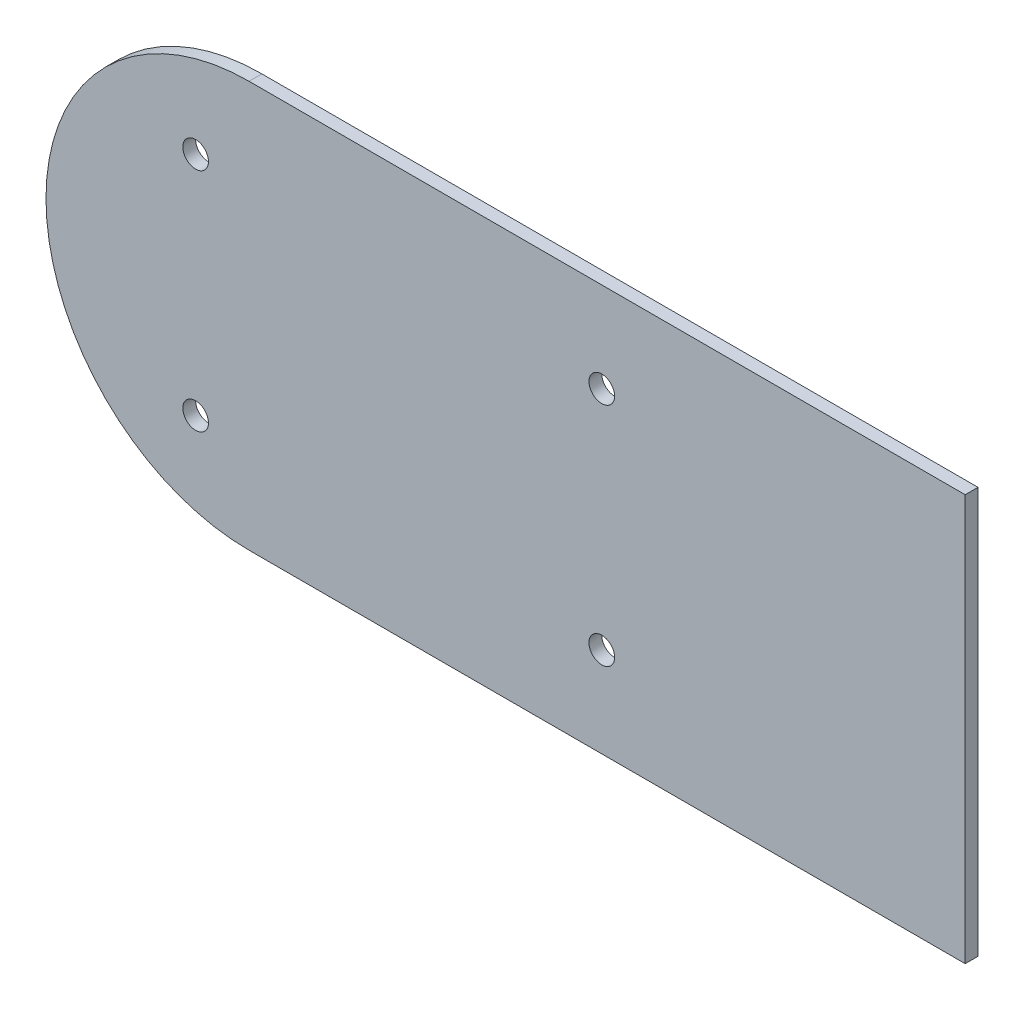
ISO-10303-21;
HEADER;
FILE_DESCRIPTION(('STEP AP214'),'2;1');
FILE_NAME('part.step','',(''),(''),'','','');
FILE_SCHEMA(('AUTOMOTIVE_DESIGN { 1 0 10303 214 1 1 1 1 }'));
ENDSEC;
DATA;
#1=APPLICATION_CONTEXT('core data for automotive mechanical design processes');
#2=APPLICATION_PROTOCOL_DEFINITION('international standard','automotive_design',2000,#1);
#3=PRODUCT_CONTEXT('',#1,'mechanical');
#4=PRODUCT('Part','Part','',(#3));
#5=PRODUCT_RELATED_PRODUCT_CATEGORY('part','',(#4));
#6=PRODUCT_DEFINITION_FORMATION('','',#4);
#7=PRODUCT_DEFINITION_CONTEXT('part definition',#1,'design');
#8=PRODUCT_DEFINITION('design','',#6,#7);
#9=PRODUCT_DEFINITION_SHAPE('','',#8);
#10=(LENGTH_UNIT() NAMED_UNIT(*) SI_UNIT(.MILLI.,.METRE.));
#11=(NAMED_UNIT(*) PLANE_ANGLE_UNIT() SI_UNIT($,.RADIAN.));
#12=(NAMED_UNIT(*) SI_UNIT($,.STERADIAN.) SOLID_ANGLE_UNIT());
#13=UNCERTAINTY_MEASURE_WITH_UNIT(LENGTH_MEASURE(1.E-05),#10,'distance_accuracy_value','');
#14=(GEOMETRIC_REPRESENTATION_CONTEXT(3) GLOBAL_UNCERTAINTY_ASSIGNED_CONTEXT((#13)) GLOBAL_UNIT_ASSIGNED_CONTEXT((#10,
#11,#12)) REPRESENTATION_CONTEXT('',''));
#15=CARTESIAN_POINT('',(0.,0.,0.));
#16=DIRECTION('',(0.,0.,1.));
#17=DIRECTION('',(1.,0.,0.));
#18=AXIS2_PLACEMENT_3D('',#15,#16,#17);
#19=CARTESIAN_POINT('',(0.,0.,6.));
#20=DIRECTION('',(0.,0.,1.));
#21=DIRECTION('',(1.,0.,0.));
#22=AXIS2_PLACEMENT_3D('',#19,#20,#21);
#23=PLANE('',#22);
#24=CARTESIAN_POINT('',(45.,-52.92,6.));
#25=DIRECTION('',(0.,0.,1.));
#26=DIRECTION('',(1.,0.,0.));
#27=AXIS2_PLACEMENT_3D('',#24,#25,#26);
#28=CIRCLE('',#27,6.);
#29=CARTESIAN_POINT('',(51.,-52.92,6.));
#30=VERTEX_POINT('',#29);
#31=EDGE_CURVE('E139',#30,#30,#28,.T.);
#32=ORIENTED_EDGE('',*,*,#31,.F.);
#33=EDGE_LOOP('',(#32));
#34=FACE_BOUND('',#33,.T.);
#35=CARTESIAN_POINT('',(-145.,52.92,6.));
#36=DIRECTION('',(0.,0.,1.));
#37=DIRECTION('',(1.,0.,0.));
#38=AXIS2_PLACEMENT_3D('',#35,#36,#37);
#39=CIRCLE('',#38,6.00000000000002);
#40=CARTESIAN_POINT('',(-139.,52.92,6.));
#41=VERTEX_POINT('',#40);
#42=EDGE_CURVE('E110',#41,#41,#39,.T.);
#43=ORIENTED_EDGE('',*,*,#42,.F.);
#44=EDGE_LOOP('',(#43));
#45=FACE_BOUND('',#44,.T.);
#46=CARTESIAN_POINT('',(-120.,0.,6.));
#47=DIRECTION('',(0.,0.,1.));
#48=DIRECTION('',(1.,0.,0.));
#49=AXIS2_PLACEMENT_3D('',#46,#47,#48);
#50=CIRCLE('',#49,95.);
#51=CARTESIAN_POINT('',(-120.,95.,6.));
#52=VERTEX_POINT('',#51);
#53=CARTESIAN_POINT('',(-215.,0.,6.));
#54=VERTEX_POINT('',#53);
#55=EDGE_CURVE('E54',#52,#54,#50,.T.);
#56=ORIENTED_EDGE('',*,*,#55,.T.);
#57=CARTESIAN_POINT('',(-120.,0.,6.));
#58=DIRECTION('',(0.,0.,1.));
#59=DIRECTION('',(1.,0.,0.));
#60=AXIS2_PLACEMENT_3D('',#57,#58,#59);
#61=CIRCLE('',#60,95.);
#62=CARTESIAN_POINT('',(-120.,-95.,6.));
#63=VERTEX_POINT('',#62);
#64=EDGE_CURVE('E42',#54,#63,#61,.T.);
#65=ORIENTED_EDGE('',*,*,#64,.T.);
#66=DIRECTION('',(1.,0.,0.));
#67=VECTOR('',#66,1.);
#68=CARTESIAN_POINT('',(215.,-94.9999999999999,6.));
#69=LINE('',#68,#67);
#70=CARTESIAN_POINT('',(215.,-94.9999999999999,6.));
#71=VERTEX_POINT('',#70);
#72=EDGE_CURVE('E79',#63,#71,#69,.T.);
#73=ORIENTED_EDGE('',*,*,#72,.T.);
#74=DIRECTION('',(0.,1.,0.));
#75=VECTOR('',#74,1.);
#76=CARTESIAN_POINT('',(215.,-94.9999999999999,6.));
#77=LINE('',#76,#75);
#78=CARTESIAN_POINT('',(215.,95.0000000000001,6.));
#79=VERTEX_POINT('',#78);
#80=EDGE_CURVE('E83',#71,#79,#77,.T.);
#81=ORIENTED_EDGE('',*,*,#80,.T.);
#82=DIRECTION('',(-1.,0.,0.));
#83=VECTOR('',#82,1.);
#84=CARTESIAN_POINT('',(215.,95.0000000000001,6.));
#85=LINE('',#84,#83);
#86=EDGE_CURVE('E103',#79,#52,#85,.T.);
#87=ORIENTED_EDGE('',*,*,#86,.T.);
#88=EDGE_LOOP('',(#56,#65,#73,#81,#87));
#89=FACE_BOUND('',#88,.T.);
#90=CARTESIAN_POINT('',(45.,52.92,6.));
#91=DIRECTION('',(0.,0.,1.));
#92=DIRECTION('',(1.,0.,0.));
#93=AXIS2_PLACEMENT_3D('',#90,#91,#92);
#94=CIRCLE('',#93,6.);
#95=CARTESIAN_POINT('',(51.,52.92,6.));
#96=VERTEX_POINT('',#95);
#97=EDGE_CURVE('E145',#96,#96,#94,.T.);
#98=ORIENTED_EDGE('',*,*,#97,.F.);
#99=EDGE_LOOP('',(#98));
#100=FACE_BOUND('',#99,.T.);
#101=CARTESIAN_POINT('',(-145.,-52.92,6.));
#102=DIRECTION('',(0.,0.,1.));
#103=DIRECTION('',(1.,0.,0.));
#104=AXIS2_PLACEMENT_3D('',#101,#102,#103);
#105=CIRCLE('',#104,6.00000000000002);
#106=CARTESIAN_POINT('',(-139.,-52.92,6.));
#107=VERTEX_POINT('',#106);
#108=EDGE_CURVE('E131',#107,#107,#105,.T.);
#109=ORIENTED_EDGE('',*,*,#108,.F.);
#110=EDGE_LOOP('',(#109));
#111=FACE_BOUND('',#110,.T.);
#112=ADVANCED_FACE('F33',(#34,#45,#89,#100,#111),#23,.T.);
#113=CARTESIAN_POINT('',(0.,0.,0.));
#114=DIRECTION('',(0.,0.,1.));
#115=DIRECTION('',(1.,0.,0.));
#116=AXIS2_PLACEMENT_3D('',#113,#114,#115);
#117=PLANE('',#116);
#118=DIRECTION('',(1.,0.,0.));
#119=VECTOR('',#118,1.);
#120=CARTESIAN_POINT('',(215.,-94.9999999999999,0.));
#121=LINE('',#120,#119);
#122=CARTESIAN_POINT('',(-120.,-95.,0.));
#123=VERTEX_POINT('',#122);
#124=CARTESIAN_POINT('',(215.,-94.9999999999999,0.));
#125=VERTEX_POINT('',#124);
#126=EDGE_CURVE('E95',#123,#125,#121,.T.);
#127=ORIENTED_EDGE('',*,*,#126,.F.);
#128=CARTESIAN_POINT('',(-120.,0.,0.));
#129=DIRECTION('',(0.,0.,1.));
#130=DIRECTION('',(1.,0.,0.));
#131=AXIS2_PLACEMENT_3D('',#128,#129,#130);
#132=CIRCLE('',#131,95.);
#133=CARTESIAN_POINT('',(-215.,0.,0.));
#134=VERTEX_POINT('',#133);
#135=EDGE_CURVE('E117',#123,#134,#132,.F.);
#136=ORIENTED_EDGE('',*,*,#135,.T.);
#137=CARTESIAN_POINT('',(-120.,0.,0.));
#138=DIRECTION('',(0.,0.,1.));
#139=DIRECTION('',(1.,0.,0.));
#140=AXIS2_PLACEMENT_3D('',#137,#138,#139);
#141=CIRCLE('',#140,95.);
#142=CARTESIAN_POINT('',(-120.,95.,0.));
#143=VERTEX_POINT('',#142);
#144=EDGE_CURVE('E115',#134,#143,#141,.F.);
#145=ORIENTED_EDGE('',*,*,#144,.T.);
#146=DIRECTION('',(-1.,0.,0.));
#147=VECTOR('',#146,1.);
#148=CARTESIAN_POINT('',(215.,95.0000000000001,0.));
#149=LINE('',#148,#147);
#150=CARTESIAN_POINT('',(215.,95.0000000000001,0.));
#151=VERTEX_POINT('',#150);
#152=EDGE_CURVE('E89',#151,#143,#149,.T.);
#153=ORIENTED_EDGE('',*,*,#152,.F.);
#154=DIRECTION('',(0.,1.,0.));
#155=VECTOR('',#154,1.);
#156=CARTESIAN_POINT('',(215.,-94.9999999999999,0.));
#157=LINE('',#156,#155);
#158=EDGE_CURVE('E109',#125,#151,#157,.T.);
#159=ORIENTED_EDGE('',*,*,#158,.F.);
#160=EDGE_LOOP('',(#127,#136,#145,#153,#159));
#161=FACE_BOUND('',#160,.T.);
#162=CARTESIAN_POINT('',(-145.,52.92,0.));
#163=DIRECTION('',(0.,0.,1.));
#164=DIRECTION('',(1.,0.,0.));
#165=AXIS2_PLACEMENT_3D('',#162,#163,#164);
#166=CIRCLE('',#165,6.00000000000002);
#167=CARTESIAN_POINT('',(-139.,52.92,0.));
#168=VERTEX_POINT('',#167);
#169=EDGE_CURVE('E148',#168,#168,#166,.T.);
#170=ORIENTED_EDGE('',*,*,#169,.T.);
#171=EDGE_LOOP('',(#170));
#172=FACE_BOUND('',#171,.T.);
#173=CARTESIAN_POINT('',(45.,52.92,0.));
#174=DIRECTION('',(0.,0.,1.));
#175=DIRECTION('',(1.,0.,0.));
#176=AXIS2_PLACEMENT_3D('',#173,#174,#175);
#177=CIRCLE('',#176,6.);
#178=CARTESIAN_POINT('',(51.,52.92,0.));
#179=VERTEX_POINT('',#178);
#180=EDGE_CURVE('E142',#179,#179,#177,.T.);
#181=ORIENTED_EDGE('',*,*,#180,.T.);
#182=EDGE_LOOP('',(#181));
#183=FACE_BOUND('',#182,.T.);
#184=CARTESIAN_POINT('',(45.,-52.92,0.));
#185=DIRECTION('',(0.,0.,1.));
#186=DIRECTION('',(1.,0.,0.));
#187=AXIS2_PLACEMENT_3D('',#184,#185,#186);
#188=CIRCLE('',#187,6.);
#189=CARTESIAN_POINT('',(51.,-52.92,0.));
#190=VERTEX_POINT('',#189);
#191=EDGE_CURVE('E136',#190,#190,#188,.T.);
#192=ORIENTED_EDGE('',*,*,#191,.T.);
#193=EDGE_LOOP('',(#192));
#194=FACE_BOUND('',#193,.T.);
#195=CARTESIAN_POINT('',(-145.,-52.92,0.));
#196=DIRECTION('',(0.,0.,1.));
#197=DIRECTION('',(1.,0.,0.));
#198=AXIS2_PLACEMENT_3D('',#195,#196,#197);
#199=CIRCLE('',#198,6.00000000000002);
#200=CARTESIAN_POINT('',(-139.,-52.92,0.));
#201=VERTEX_POINT('',#200);
#202=EDGE_CURVE('E129',#201,#201,#199,.T.);
#203=ORIENTED_EDGE('',*,*,#202,.T.);
#204=EDGE_LOOP('',(#203));
#205=FACE_BOUND('',#204,.T.);
#206=ADVANCED_FACE('F122',(#161,#172,#183,#194,#205),#117,.F.);
#207=CARTESIAN_POINT('',(215.,-94.9999999999999,6.));
#208=DIRECTION('',(0.,1.,0.));
#209=DIRECTION('',(-1.,0.,0.));
#210=AXIS2_PLACEMENT_3D('',#207,#208,#209);
#211=PLANE('',#210);
#212=ORIENTED_EDGE('',*,*,#72,.F.);
#213=DIRECTION('',(0.,0.,-1.));
#214=VECTOR('',#213,1.);
#215=CARTESIAN_POINT('',(-120.,-95.,6.));
#216=LINE('',#215,#214);
#217=EDGE_CURVE('E98',#63,#123,#216,.T.);
#218=ORIENTED_EDGE('',*,*,#217,.T.);
#219=ORIENTED_EDGE('',*,*,#126,.T.);
#220=DIRECTION('',(0.,0.,-1.));
#221=VECTOR('',#220,1.);
#222=CARTESIAN_POINT('',(215.,-94.9999999999999,6.));
#223=LINE('',#222,#221);
#224=EDGE_CURVE('E92',#71,#125,#223,.T.);
#225=ORIENTED_EDGE('',*,*,#224,.F.);
#226=EDGE_LOOP('',(#212,#218,#219,#225));
#227=FACE_BOUND('',#226,.T.);
#228=ADVANCED_FACE('F93',(#227),#211,.F.);
#229=CARTESIAN_POINT('',(215.,-94.9999999999999,6.));
#230=DIRECTION('',(-1.,0.,0.));
#231=DIRECTION('',(0.,0.,1.));
#232=AXIS2_PLACEMENT_3D('',#229,#230,#231);
#233=PLANE('',#232);
#234=ORIENTED_EDGE('',*,*,#158,.T.);
#235=DIRECTION('',(0.,0.,-1.));
#236=VECTOR('',#235,1.);
#237=CARTESIAN_POINT('',(215.,95.0000000000001,6.));
#238=LINE('',#237,#236);
#239=EDGE_CURVE('E99',#79,#151,#238,.T.);
#240=ORIENTED_EDGE('',*,*,#239,.F.);
#241=ORIENTED_EDGE('',*,*,#80,.F.);
#242=ORIENTED_EDGE('',*,*,#224,.T.);
#243=EDGE_LOOP('',(#234,#240,#241,#242));
#244=FACE_BOUND('',#243,.T.);
#245=ADVANCED_FACE('F101',(#244),#233,.F.);
#246=CARTESIAN_POINT('',(215.,95.0000000000001,6.));
#247=DIRECTION('',(0.,-1.,0.));
#248=DIRECTION('',(1.,0.,0.));
#249=AXIS2_PLACEMENT_3D('',#246,#247,#248);
#250=PLANE('',#249);
#251=ORIENTED_EDGE('',*,*,#152,.T.);
#252=DIRECTION('',(0.,0.,-1.));
#253=VECTOR('',#252,1.);
#254=CARTESIAN_POINT('',(-120.,95.,6.));
#255=LINE('',#254,#253);
#256=EDGE_CURVE('E11',#143,#52,#255,.F.);
#257=ORIENTED_EDGE('',*,*,#256,.T.);
#258=ORIENTED_EDGE('',*,*,#86,.F.);
#259=ORIENTED_EDGE('',*,*,#239,.T.);
#260=EDGE_LOOP('',(#251,#257,#258,#259));
#261=FACE_BOUND('',#260,.T.);
#262=ADVANCED_FACE('F159',(#261),#250,.F.);
#263=CARTESIAN_POINT('',(-145.,52.92,6.));
#264=DIRECTION('',(0.,0.,-1.));
#265=DIRECTION('',(-1.,0.,0.));
#266=AXIS2_PLACEMENT_3D('',#263,#264,#265);
#267=CYLINDRICAL_SURFACE('',#266,6.00000000000002);
#268=ORIENTED_EDGE('',*,*,#42,.T.);
#269=EDGE_LOOP('',(#268));
#270=FACE_BOUND('',#269,.T.);
#271=ORIENTED_EDGE('',*,*,#169,.F.);
#272=EDGE_LOOP('',(#271));
#273=FACE_BOUND('',#272,.T.);
#274=ADVANCED_FACE('F156',(#270,#273),#267,.F.);
#275=CARTESIAN_POINT('',(45.,52.92,6.));
#276=DIRECTION('',(0.,0.,-1.));
#277=DIRECTION('',(-1.,0.,0.));
#278=AXIS2_PLACEMENT_3D('',#275,#276,#277);
#279=CYLINDRICAL_SURFACE('',#278,6.);
#280=ORIENTED_EDGE('',*,*,#97,.T.);
#281=EDGE_LOOP('',(#280));
#282=FACE_BOUND('',#281,.T.);
#283=ORIENTED_EDGE('',*,*,#180,.F.);
#284=EDGE_LOOP('',(#283));
#285=FACE_BOUND('',#284,.T.);
#286=ADVANCED_FACE('F158',(#282,#285),#279,.F.);
#287=CARTESIAN_POINT('',(45.,-52.92,6.));
#288=DIRECTION('',(0.,0.,-1.));
#289=DIRECTION('',(-1.,0.,0.));
#290=AXIS2_PLACEMENT_3D('',#287,#288,#289);
#291=CYLINDRICAL_SURFACE('',#290,6.);
#292=ORIENTED_EDGE('',*,*,#31,.T.);
#293=EDGE_LOOP('',(#292));
#294=FACE_BOUND('',#293,.T.);
#295=ORIENTED_EDGE('',*,*,#191,.F.);
#296=EDGE_LOOP('',(#295));
#297=FACE_BOUND('',#296,.T.);
#298=ADVANCED_FACE('F166',(#294,#297),#291,.F.);
#299=CARTESIAN_POINT('',(-145.,-52.92,6.));
#300=DIRECTION('',(0.,0.,-1.));
#301=DIRECTION('',(-1.,0.,0.));
#302=AXIS2_PLACEMENT_3D('',#299,#300,#301);
#303=CYLINDRICAL_SURFACE('',#302,6.00000000000002);
#304=ORIENTED_EDGE('',*,*,#108,.T.);
#305=EDGE_LOOP('',(#304));
#306=FACE_BOUND('',#305,.T.);
#307=ORIENTED_EDGE('',*,*,#202,.F.);
#308=EDGE_LOOP('',(#307));
#309=FACE_BOUND('',#308,.T.);
#310=ADVANCED_FACE('F187',(#306,#309),#303,.F.);
#311=CARTESIAN_POINT('',(-120.,0.,6.));
#312=DIRECTION('',(0.,0.,-1.));
#313=DIRECTION('',(-1.,0.,0.));
#314=AXIS2_PLACEMENT_3D('',#311,#312,#313);
#315=CYLINDRICAL_SURFACE('',#314,95.);
#316=DIRECTION('',(0.,0.,-1.));
#317=VECTOR('',#316,1.);
#318=CARTESIAN_POINT('',(-215.,0.,6.));
#319=LINE('',#318,#317);
#320=EDGE_CURVE('E37',#54,#134,#319,.T.);
#321=ORIENTED_EDGE('',*,*,#320,.F.);
#322=ORIENTED_EDGE('',*,*,#55,.F.);
#323=ORIENTED_EDGE('',*,*,#256,.F.);
#324=ORIENTED_EDGE('',*,*,#144,.F.);
#325=EDGE_LOOP('',(#321,#322,#323,#324));
#326=FACE_BOUND('',#325,.T.);
#327=ADVANCED_FACE('F35',(#326),#315,.T.);
#328=CARTESIAN_POINT('',(-120.,0.,6.));
#329=DIRECTION('',(0.,0.,-1.));
#330=DIRECTION('',(-1.,0.,0.));
#331=AXIS2_PLACEMENT_3D('',#328,#329,#330);
#332=CYLINDRICAL_SURFACE('',#331,95.);
#333=ORIENTED_EDGE('',*,*,#64,.F.);
#334=ORIENTED_EDGE('',*,*,#320,.T.);
#335=ORIENTED_EDGE('',*,*,#135,.F.);
#336=ORIENTED_EDGE('',*,*,#217,.F.);
#337=EDGE_LOOP('',(#333,#334,#335,#336));
#338=FACE_BOUND('',#337,.T.);
#339=ADVANCED_FACE('F128',(#338),#332,.T.);
#340=CLOSED_SHELL('',(#112,#206,#228,#245,#262,#274,#286,#298,#310,#327,#339));
#341=MANIFOLD_SOLID_BREP('B2',#340);
#342=ADVANCED_BREP_SHAPE_REPRESENTATION('',(#18,#341),#14);
#343=SHAPE_DEFINITION_REPRESENTATION(#9,#342);
ENDSEC;
END-ISO-10303-21;
